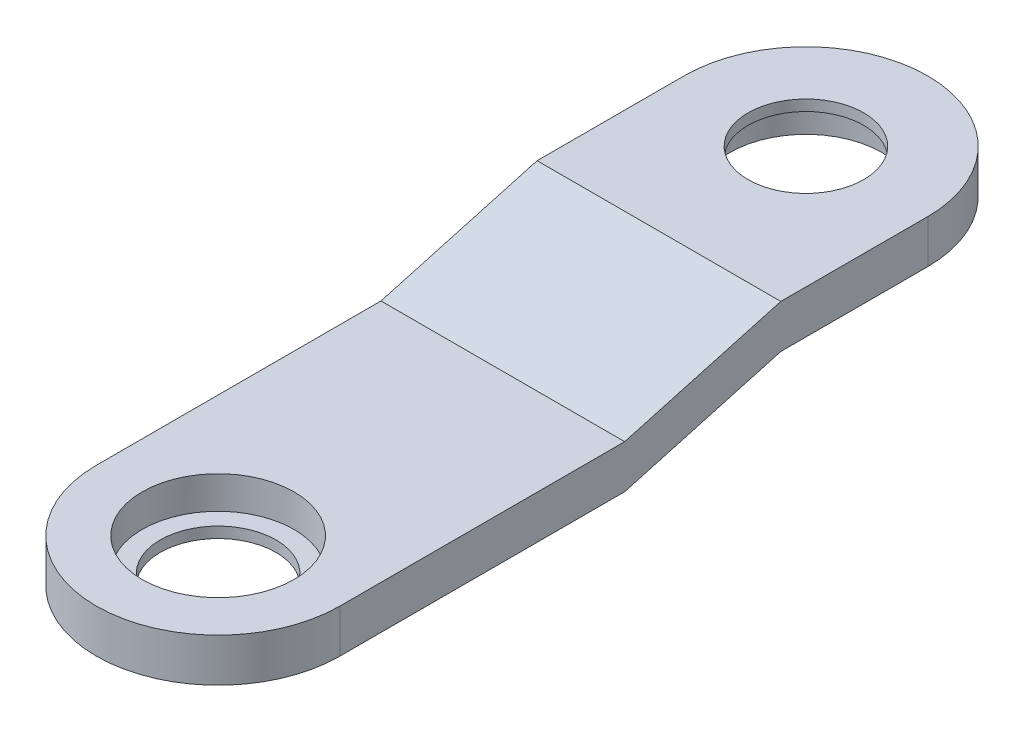
ISO-10303-21;
HEADER;
FILE_DESCRIPTION(('STEP AP214'),'2;1');
FILE_NAME('part.step','',(''),(''),'','','');
FILE_SCHEMA(('AUTOMOTIVE_DESIGN { 1 0 10303 214 1 1 1 1 }'));
ENDSEC;
DATA;
#1=APPLICATION_CONTEXT('core data for automotive mechanical design processes');
#2=APPLICATION_PROTOCOL_DEFINITION('international standard','automotive_design',2000,#1);
#3=PRODUCT_CONTEXT('',#1,'mechanical');
#4=PRODUCT('Part','Part','',(#3));
#5=PRODUCT_RELATED_PRODUCT_CATEGORY('part','',(#4));
#6=PRODUCT_DEFINITION_FORMATION('','',#4);
#7=PRODUCT_DEFINITION_CONTEXT('part definition',#1,'design');
#8=PRODUCT_DEFINITION('design','',#6,#7);
#9=PRODUCT_DEFINITION_SHAPE('','',#8);
#10=(LENGTH_UNIT() NAMED_UNIT(*) SI_UNIT(.MILLI.,.METRE.));
#11=(NAMED_UNIT(*) PLANE_ANGLE_UNIT() SI_UNIT($,.RADIAN.));
#12=(NAMED_UNIT(*) SI_UNIT($,.STERADIAN.) SOLID_ANGLE_UNIT());
#13=UNCERTAINTY_MEASURE_WITH_UNIT(LENGTH_MEASURE(1.E-05),#10,'distance_accuracy_value','');
#14=(GEOMETRIC_REPRESENTATION_CONTEXT(3) GLOBAL_UNCERTAINTY_ASSIGNED_CONTEXT((#13)) GLOBAL_UNIT_ASSIGNED_CONTEXT((#10,
#11,#12)) REPRESENTATION_CONTEXT('',''));
#15=CARTESIAN_POINT('',(0.,0.,0.));
#16=DIRECTION('',(0.,0.,1.));
#17=DIRECTION('',(1.,0.,0.));
#18=AXIS2_PLACEMENT_3D('',#15,#16,#17);
#19=CARTESIAN_POINT('',(0.,0.,0.));
#20=DIRECTION('',(0.,1.,0.));
#21=DIRECTION('',(0.,0.,1.));
#22=AXIS2_PLACEMENT_3D('',#19,#20,#21);
#23=PLANE('',#22);
#24=CARTESIAN_POINT('',(0.,0.,0.));
#25=DIRECTION('',(0.,-1.,0.));
#26=DIRECTION('',(0.,0.,-1.));
#27=AXIS2_PLACEMENT_3D('',#24,#25,#26);
#28=CIRCLE('',#27,8.);
#29=CARTESIAN_POINT('',(0.,0.,-8.));
#30=VERTEX_POINT('',#29);
#31=EDGE_CURVE('E189',#30,#30,#28,.T.);
#32=ORIENTED_EDGE('',*,*,#31,.F.);
#33=EDGE_LOOP('',(#32));
#34=FACE_BOUND('',#33,.T.);
#35=DIRECTION('',(-1.,0.,0.));
#36=VECTOR('',#35,1.);
#37=CARTESIAN_POINT('',(16.849999955,0.,-39.37));
#38=LINE('',#37,#36);
#39=CARTESIAN_POINT('',(16.849999955,0.,-39.37));
#40=VERTEX_POINT('',#39);
#41=CARTESIAN_POINT('',(-16.849999955,0.,-39.37));
#42=VERTEX_POINT('',#41);
#43=EDGE_CURVE('E124',#40,#42,#38,.T.);
#44=ORIENTED_EDGE('',*,*,#43,.F.);
#45=DIRECTION('',(0.,0.,-1.));
#46=VECTOR('',#45,1.);
#47=CARTESIAN_POINT('',(16.849999955,0.,0.));
#48=LINE('',#47,#46);
#49=CARTESIAN_POINT('',(16.849999955,0.,0.));
#50=VERTEX_POINT('',#49);
#51=EDGE_CURVE('E122',#50,#40,#48,.T.);
#52=ORIENTED_EDGE('',*,*,#51,.F.);
#53=CARTESIAN_POINT('',(0.,0.,0.));
#54=DIRECTION('',(0.,1.,0.));
#55=DIRECTION('',(0.,0.,1.));
#56=AXIS2_PLACEMENT_3D('',#53,#54,#55);
#57=CIRCLE('',#56,16.849999955);
#58=CARTESIAN_POINT('',(-16.849999955,0.,0.));
#59=VERTEX_POINT('',#58);
#60=EDGE_CURVE('E136',#59,#50,#57,.T.);
#61=ORIENTED_EDGE('',*,*,#60,.F.);
#62=DIRECTION('',(0.,0.,1.));
#63=VECTOR('',#62,1.);
#64=CARTESIAN_POINT('',(-16.849999955,0.,0.));
#65=LINE('',#64,#63);
#66=EDGE_CURVE('E145',#42,#59,#65,.T.);
#67=ORIENTED_EDGE('',*,*,#66,.F.);
#68=EDGE_LOOP('',(#44,#52,#61,#67));
#69=FACE_BOUND('',#68,.T.);
#70=ADVANCED_FACE('F39',(#34,#69),#23,.F.);
#71=CARTESIAN_POINT('',(16.849999955,12.,0.));
#72=DIRECTION('',(-1.,0.,0.));
#73=DIRECTION('',(0.,0.,1.));
#74=AXIS2_PLACEMENT_3D('',#71,#72,#73);
#75=PLANE('',#74);
#76=DIRECTION('',(0.,-0.267758944517911,0.963485935356949));
#77=VECTOR('',#76,1.);
#78=CARTESIAN_POINT('',(16.849999955,6.,-60.96));
#79=LINE('',#78,#77);
#80=CARTESIAN_POINT('',(16.849999955,6.,-60.96));
#81=VERTEX_POINT('',#80);
#82=EDGE_CURVE('E105',#81,#40,#79,.T.);
#83=ORIENTED_EDGE('',*,*,#82,.F.);
#84=DIRECTION('',(0.,0.,1.));
#85=VECTOR('',#84,1.);
#86=CARTESIAN_POINT('',(16.849999955,6.,0.));
#87=LINE('',#86,#85);
#88=CARTESIAN_POINT('',(16.849999955,6.,-81.28));
#89=VERTEX_POINT('',#88);
#90=EDGE_CURVE('E119',#89,#81,#87,.T.);
#91=ORIENTED_EDGE('',*,*,#90,.F.);
#92=DIRECTION('',(0.,-1.,0.));
#93=VECTOR('',#92,1.);
#94=CARTESIAN_POINT('',(16.849999955,12.,-81.28));
#95=LINE('',#94,#93);
#96=CARTESIAN_POINT('',(16.849999955,12.,-81.28));
#97=VERTEX_POINT('',#96);
#98=EDGE_CURVE('E49',#97,#89,#95,.T.);
#99=ORIENTED_EDGE('',*,*,#98,.F.);
#100=DIRECTION('',(0.,0.,-1.));
#101=VECTOR('',#100,1.);
#102=CARTESIAN_POINT('',(16.849999955,12.,0.));
#103=LINE('',#102,#101);
#104=CARTESIAN_POINT('',(16.849999955,12.,-60.96));
#105=VERTEX_POINT('',#104);
#106=EDGE_CURVE('E141',#105,#97,#103,.T.);
#107=ORIENTED_EDGE('',*,*,#106,.F.);
#108=DIRECTION('',(0.,0.267758944517911,-0.963485935356949));
#109=VECTOR('',#108,1.);
#110=CARTESIAN_POINT('',(16.849999955,6.,-39.37));
#111=LINE('',#110,#109);
#112=CARTESIAN_POINT('',(16.849999955,6.,-39.37));
#113=VERTEX_POINT('',#112);
#114=EDGE_CURVE('E175',#113,#105,#111,.T.);
#115=ORIENTED_EDGE('',*,*,#114,.F.);
#116=DIRECTION('',(0.,0.,-1.));
#117=VECTOR('',#116,1.);
#118=CARTESIAN_POINT('',(16.849999955,6.,-20.32));
#119=LINE('',#118,#117);
#120=CARTESIAN_POINT('',(16.849999955,6.,0.));
#121=VERTEX_POINT('',#120);
#122=EDGE_CURVE('E209',#121,#113,#119,.T.);
#123=ORIENTED_EDGE('',*,*,#122,.F.);
#124=DIRECTION('',(0.,-1.,0.));
#125=VECTOR('',#124,1.);
#126=CARTESIAN_POINT('',(16.849999955,12.,0.));
#127=LINE('',#126,#125);
#128=EDGE_CURVE('E11',#121,#50,#127,.T.);
#129=ORIENTED_EDGE('',*,*,#128,.T.);
#130=ORIENTED_EDGE('',*,*,#51,.T.);
#131=EDGE_LOOP('',(#83,#91,#99,#107,#115,#123,#129,#130));
#132=FACE_BOUND('',#131,.T.);
#133=ADVANCED_FACE('F117',(#132),#75,.F.);
#134=CARTESIAN_POINT('',(-16.849999955,12.,0.));
#135=DIRECTION('',(1.,0.,0.));
#136=DIRECTION('',(0.,0.,-1.));
#137=AXIS2_PLACEMENT_3D('',#134,#135,#136);
#138=PLANE('',#137);
#139=DIRECTION('',(0.,-0.267758944517911,0.963485935356949));
#140=VECTOR('',#139,1.);
#141=CARTESIAN_POINT('',(-16.849999955,6.,-60.96));
#142=LINE('',#141,#140);
#143=CARTESIAN_POINT('',(-16.849999955,6.,-60.96));
#144=VERTEX_POINT('',#143);
#145=EDGE_CURVE('E64',#144,#42,#142,.T.);
#146=ORIENTED_EDGE('',*,*,#145,.T.);
#147=ORIENTED_EDGE('',*,*,#66,.T.);
#148=DIRECTION('',(0.,-1.,0.));
#149=VECTOR('',#148,1.);
#150=CARTESIAN_POINT('',(-16.849999955,12.,0.));
#151=LINE('',#150,#149);
#152=CARTESIAN_POINT('',(-16.849999955,6.,0.));
#153=VERTEX_POINT('',#152);
#154=EDGE_CURVE('E152',#153,#59,#151,.T.);
#155=ORIENTED_EDGE('',*,*,#154,.F.);
#156=DIRECTION('',(0.,0.,1.));
#157=VECTOR('',#156,1.);
#158=CARTESIAN_POINT('',(-16.849999955,6.,0.));
#159=LINE('',#158,#157);
#160=CARTESIAN_POINT('',(-16.849999955,6.,-39.37));
#161=VERTEX_POINT('',#160);
#162=EDGE_CURVE('E56',#161,#153,#159,.T.);
#163=ORIENTED_EDGE('',*,*,#162,.F.);
#164=DIRECTION('',(0.,0.267758944517911,-0.963485935356949));
#165=VECTOR('',#164,1.);
#166=CARTESIAN_POINT('',(-16.849999955,6.,-39.37));
#167=LINE('',#166,#165);
#168=CARTESIAN_POINT('',(-16.849999955,12.,-60.96));
#169=VERTEX_POINT('',#168);
#170=EDGE_CURVE('E191',#161,#169,#167,.T.);
#171=ORIENTED_EDGE('',*,*,#170,.T.);
#172=DIRECTION('',(0.,0.,1.));
#173=VECTOR('',#172,1.);
#174=CARTESIAN_POINT('',(-16.849999955,12.,0.));
#175=LINE('',#174,#173);
#176=CARTESIAN_POINT('',(-16.849999955,12.,-81.28));
#177=VERTEX_POINT('',#176);
#178=EDGE_CURVE('E148',#177,#169,#175,.T.);
#179=ORIENTED_EDGE('',*,*,#178,.F.);
#180=DIRECTION('',(0.,-1.,0.));
#181=VECTOR('',#180,1.);
#182=CARTESIAN_POINT('',(-16.849999955,12.,-81.28));
#183=LINE('',#182,#181);
#184=CARTESIAN_POINT('',(-16.849999955,6.,-81.28));
#185=VERTEX_POINT('',#184);
#186=EDGE_CURVE('E163',#177,#185,#183,.T.);
#187=ORIENTED_EDGE('',*,*,#186,.T.);
#188=DIRECTION('',(0.,0.,-1.));
#189=VECTOR('',#188,1.);
#190=CARTESIAN_POINT('',(-16.849999955,6.,0.));
#191=LINE('',#190,#189);
#192=EDGE_CURVE('E111',#144,#185,#191,.T.);
#193=ORIENTED_EDGE('',*,*,#192,.F.);
#194=EDGE_LOOP('',(#146,#147,#155,#163,#171,#179,#187,#193));
#195=FACE_BOUND('',#194,.T.);
#196=ADVANCED_FACE('F226',(#195),#138,.F.);
#197=CARTESIAN_POINT('',(0.,12.,0.));
#198=DIRECTION('',(0.,1.,0.));
#199=DIRECTION('',(0.,0.,1.));
#200=AXIS2_PLACEMENT_3D('',#197,#198,#199);
#201=PLANE('',#200);
#202=CARTESIAN_POINT('',(0.,12.,-81.28));
#203=DIRECTION('',(0.,1.,0.));
#204=DIRECTION('',(0.,0.,1.));
#205=AXIS2_PLACEMENT_3D('',#202,#203,#204);
#206=CIRCLE('',#205,8.);
#207=CARTESIAN_POINT('',(0.,12.,-73.28));
#208=VERTEX_POINT('',#207);
#209=EDGE_CURVE('E218',#208,#208,#206,.T.);
#210=ORIENTED_EDGE('',*,*,#209,.F.);
#211=EDGE_LOOP('',(#210));
#212=FACE_BOUND('',#211,.T.);
#213=ORIENTED_EDGE('',*,*,#178,.T.);
#214=DIRECTION('',(-1.,0.,0.));
#215=VECTOR('',#214,1.);
#216=CARTESIAN_POINT('',(16.849999955,12.,-60.96));
#217=LINE('',#216,#215);
#218=EDGE_CURVE('E179',#105,#169,#217,.T.);
#219=ORIENTED_EDGE('',*,*,#218,.F.);
#220=ORIENTED_EDGE('',*,*,#106,.T.);
#221=CARTESIAN_POINT('',(0.,12.,-81.28));
#222=DIRECTION('',(0.,1.,0.));
#223=DIRECTION('',(0.,0.,1.));
#224=AXIS2_PLACEMENT_3D('',#221,#222,#223);
#225=CIRCLE('',#224,16.849999955);
#226=EDGE_CURVE('E144',#97,#177,#225,.T.);
#227=ORIENTED_EDGE('',*,*,#226,.T.);
#228=EDGE_LOOP('',(#213,#219,#220,#227));
#229=FACE_BOUND('',#228,.T.);
#230=ADVANCED_FACE('F178',(#212,#229),#201,.T.);
#231=CARTESIAN_POINT('',(0.,12.,0.));
#232=DIRECTION('',(0.,-1.,0.));
#233=DIRECTION('',(0.,0.,-1.));
#234=AXIS2_PLACEMENT_3D('',#231,#232,#233);
#235=CYLINDRICAL_SURFACE('',#234,10.499999955);
#236=CARTESIAN_POINT('',(0.,6.,0.));
#237=DIRECTION('',(0.,1.,0.));
#238=DIRECTION('',(0.,0.,1.));
#239=AXIS2_PLACEMENT_3D('',#236,#237,#238);
#240=CIRCLE('',#239,10.499999955);
#241=CARTESIAN_POINT('',(0.,6.,10.499999955));
#242=VERTEX_POINT('',#241);
#243=EDGE_CURVE('E43',#242,#242,#240,.T.);
#244=ORIENTED_EDGE('',*,*,#243,.T.);
#245=EDGE_LOOP('',(#244));
#246=FACE_BOUND('',#245,.T.);
#247=CARTESIAN_POINT('',(0.,1.5,0.));
#248=DIRECTION('',(0.,-1.,0.));
#249=DIRECTION('',(0.,0.,-1.));
#250=AXIS2_PLACEMENT_3D('',#247,#248,#249);
#251=CIRCLE('',#250,10.499999955);
#252=CARTESIAN_POINT('',(0.,1.5,-10.499999955));
#253=VERTEX_POINT('',#252);
#254=EDGE_CURVE('E199',#253,#253,#251,.T.);
#255=ORIENTED_EDGE('',*,*,#254,.T.);
#256=EDGE_LOOP('',(#255));
#257=FACE_BOUND('',#256,.T.);
#258=ADVANCED_FACE('F277',(#246,#257),#235,.F.);
#259=CARTESIAN_POINT('',(0.,12.,0.));
#260=DIRECTION('',(0.,-1.,0.));
#261=DIRECTION('',(0.,0.,-1.));
#262=AXIS2_PLACEMENT_3D('',#259,#260,#261);
#263=CYLINDRICAL_SURFACE('',#262,16.849999955);
#264=CARTESIAN_POINT('',(0.,6.,0.));
#265=DIRECTION('',(0.,1.,0.));
#266=DIRECTION('',(0.,0.,1.));
#267=AXIS2_PLACEMENT_3D('',#264,#265,#266);
#268=CIRCLE('',#267,16.849999955);
#269=EDGE_CURVE('E206',#153,#121,#268,.T.);
#270=ORIENTED_EDGE('',*,*,#269,.F.);
#271=ORIENTED_EDGE('',*,*,#154,.T.);
#272=ORIENTED_EDGE('',*,*,#60,.T.);
#273=ORIENTED_EDGE('',*,*,#128,.F.);
#274=EDGE_LOOP('',(#270,#271,#272,#273));
#275=FACE_BOUND('',#274,.T.);
#276=ADVANCED_FACE('F41',(#275),#263,.T.);
#277=CARTESIAN_POINT('',(0.,12.,-81.28));
#278=DIRECTION('',(0.,-1.,0.));
#279=DIRECTION('',(0.,0.,-1.));
#280=AXIS2_PLACEMENT_3D('',#277,#278,#279);
#281=CYLINDRICAL_SURFACE('',#280,10.499999955);
#282=CARTESIAN_POINT('',(0.,6.,-81.28));
#283=DIRECTION('',(0.,-1.,0.));
#284=DIRECTION('',(0.,0.,-1.));
#285=AXIS2_PLACEMENT_3D('',#282,#283,#284);
#286=CIRCLE('',#285,10.499999955);
#287=CARTESIAN_POINT('',(0.,6.,-91.779999955));
#288=VERTEX_POINT('',#287);
#289=EDGE_CURVE('E131',#288,#288,#286,.F.);
#290=ORIENTED_EDGE('',*,*,#289,.F.);
#291=EDGE_LOOP('',(#290));
#292=FACE_BOUND('',#291,.T.);
#293=CARTESIAN_POINT('',(0.,10.5,-81.28));
#294=DIRECTION('',(0.,1.,0.));
#295=DIRECTION('',(0.,0.,1.));
#296=AXIS2_PLACEMENT_3D('',#293,#294,#295);
#297=CIRCLE('',#296,10.499999955);
#298=CARTESIAN_POINT('',(0.,10.5,-70.780000045));
#299=VERTEX_POINT('',#298);
#300=EDGE_CURVE('E112',#299,#299,#297,.T.);
#301=ORIENTED_EDGE('',*,*,#300,.T.);
#302=EDGE_LOOP('',(#301));
#303=FACE_BOUND('',#302,.T.);
#304=ADVANCED_FACE('F265',(#292,#303),#281,.F.);
#305=CARTESIAN_POINT('',(0.,12.,-81.28));
#306=DIRECTION('',(0.,-1.,0.));
#307=DIRECTION('',(0.,0.,-1.));
#308=AXIS2_PLACEMENT_3D('',#305,#306,#307);
#309=CYLINDRICAL_SURFACE('',#308,16.849999955);
#310=CARTESIAN_POINT('',(0.,6.,-81.28));
#311=DIRECTION('',(0.,-1.,0.));
#312=DIRECTION('',(0.,0.,-1.));
#313=AXIS2_PLACEMENT_3D('',#310,#311,#312);
#314=CIRCLE('',#313,16.849999955);
#315=EDGE_CURVE('E129',#185,#89,#314,.T.);
#316=ORIENTED_EDGE('',*,*,#315,.F.);
#317=ORIENTED_EDGE('',*,*,#186,.F.);
#318=ORIENTED_EDGE('',*,*,#226,.F.);
#319=ORIENTED_EDGE('',*,*,#98,.T.);
#320=EDGE_LOOP('',(#316,#317,#318,#319));
#321=FACE_BOUND('',#320,.T.);
#322=ADVANCED_FACE('F170',(#321),#309,.T.);
#323=CARTESIAN_POINT('',(0.,6.,0.));
#324=DIRECTION('',(0.,-1.,0.));
#325=DIRECTION('',(0.,0.,-1.));
#326=AXIS2_PLACEMENT_3D('',#323,#324,#325);
#327=PLANE('',#326);
#328=DIRECTION('',(1.,0.,0.));
#329=VECTOR('',#328,1.);
#330=CARTESIAN_POINT('',(0.,6.,-60.96));
#331=LINE('',#330,#329);
#332=EDGE_CURVE('E102',#144,#81,#331,.T.);
#333=ORIENTED_EDGE('',*,*,#332,.F.);
#334=ORIENTED_EDGE('',*,*,#192,.T.);
#335=ORIENTED_EDGE('',*,*,#315,.T.);
#336=ORIENTED_EDGE('',*,*,#90,.T.);
#337=EDGE_LOOP('',(#333,#334,#335,#336));
#338=FACE_BOUND('',#337,.T.);
#339=ORIENTED_EDGE('',*,*,#289,.T.);
#340=EDGE_LOOP('',(#339));
#341=FACE_BOUND('',#340,.T.);
#342=ADVANCED_FACE('F126',(#338,#341),#327,.T.);
#343=CARTESIAN_POINT('',(0.,10.5,-81.28));
#344=DIRECTION('',(0.,1.,0.));
#345=DIRECTION('',(0.,0.,1.));
#346=AXIS2_PLACEMENT_3D('',#343,#344,#345);
#347=PLANE('',#346);
#348=CARTESIAN_POINT('',(0.,10.5,-81.28));
#349=DIRECTION('',(0.,1.,0.));
#350=DIRECTION('',(0.,0.,1.));
#351=AXIS2_PLACEMENT_3D('',#348,#349,#350);
#352=CIRCLE('',#351,8.);
#353=CARTESIAN_POINT('',(0.,10.5,-73.28));
#354=VERTEX_POINT('',#353);
#355=EDGE_CURVE('E214',#354,#354,#352,.T.);
#356=ORIENTED_EDGE('',*,*,#355,.T.);
#357=EDGE_LOOP('',(#356));
#358=FACE_BOUND('',#357,.T.);
#359=ORIENTED_EDGE('',*,*,#300,.F.);
#360=EDGE_LOOP('',(#359));
#361=FACE_BOUND('',#360,.T.);
#362=ADVANCED_FACE('F270',(#358,#361),#347,.F.);
#363=CARTESIAN_POINT('',(0.,10.5,-81.28));
#364=DIRECTION('',(0.,1.,0.));
#365=DIRECTION('',(0.,0.,1.));
#366=AXIS2_PLACEMENT_3D('',#363,#364,#365);
#367=CYLINDRICAL_SURFACE('',#366,8.);
#368=ORIENTED_EDGE('',*,*,#355,.F.);
#369=EDGE_LOOP('',(#368));
#370=FACE_BOUND('',#369,.T.);
#371=ORIENTED_EDGE('',*,*,#209,.T.);
#372=EDGE_LOOP('',(#371));
#373=FACE_BOUND('',#372,.T.);
#374=ADVANCED_FACE('F298',(#370,#373),#367,.F.);
#375=CARTESIAN_POINT('',(0.,6.,0.));
#376=DIRECTION('',(0.,1.,0.));
#377=DIRECTION('',(0.,0.,1.));
#378=AXIS2_PLACEMENT_3D('',#375,#376,#377);
#379=PLANE('',#378);
#380=ORIENTED_EDGE('',*,*,#243,.F.);
#381=EDGE_LOOP('',(#380));
#382=FACE_BOUND('',#381,.T.);
#383=ORIENTED_EDGE('',*,*,#269,.T.);
#384=ORIENTED_EDGE('',*,*,#122,.T.);
#385=DIRECTION('',(-1.,0.,0.));
#386=VECTOR('',#385,1.);
#387=CARTESIAN_POINT('',(16.849999955,6.,-39.37));
#388=LINE('',#387,#386);
#389=EDGE_CURVE('E185',#113,#161,#388,.T.);
#390=ORIENTED_EDGE('',*,*,#389,.T.);
#391=ORIENTED_EDGE('',*,*,#162,.T.);
#392=EDGE_LOOP('',(#383,#384,#390,#391));
#393=FACE_BOUND('',#392,.T.);
#394=ADVANCED_FACE('F239',(#382,#393),#379,.T.);
#395=CARTESIAN_POINT('',(0.,1.5,0.));
#396=DIRECTION('',(0.,-1.,0.));
#397=DIRECTION('',(0.,0.,-1.));
#398=AXIS2_PLACEMENT_3D('',#395,#396,#397);
#399=PLANE('',#398);
#400=CARTESIAN_POINT('',(0.,1.5,0.));
#401=DIRECTION('',(0.,-1.,0.));
#402=DIRECTION('',(0.,0.,-1.));
#403=AXIS2_PLACEMENT_3D('',#400,#401,#402);
#404=CIRCLE('',#403,8.);
#405=CARTESIAN_POINT('',(0.,1.5,-8.));
#406=VERTEX_POINT('',#405);
#407=EDGE_CURVE('E195',#406,#406,#404,.T.);
#408=ORIENTED_EDGE('',*,*,#407,.T.);
#409=EDGE_LOOP('',(#408));
#410=FACE_BOUND('',#409,.T.);
#411=ORIENTED_EDGE('',*,*,#254,.F.);
#412=EDGE_LOOP('',(#411));
#413=FACE_BOUND('',#412,.T.);
#414=ADVANCED_FACE('F249',(#410,#413),#399,.F.);
#415=CARTESIAN_POINT('',(0.,1.5,0.));
#416=DIRECTION('',(0.,-1.,0.));
#417=DIRECTION('',(0.,0.,-1.));
#418=AXIS2_PLACEMENT_3D('',#415,#416,#417);
#419=CYLINDRICAL_SURFACE('',#418,8.);
#420=ORIENTED_EDGE('',*,*,#407,.F.);
#421=EDGE_LOOP('',(#420));
#422=FACE_BOUND('',#421,.T.);
#423=ORIENTED_EDGE('',*,*,#31,.T.);
#424=EDGE_LOOP('',(#423));
#425=FACE_BOUND('',#424,.T.);
#426=ADVANCED_FACE('F242',(#422,#425),#419,.F.);
#427=CARTESIAN_POINT('',(16.849999955,6.,-39.37));
#428=DIRECTION('',(0.,0.963485935356949,0.267758944517911));
#429=DIRECTION('',(0.,-0.267758944517911,0.963485935356949));
#430=AXIS2_PLACEMENT_3D('',#427,#428,#429);
#431=PLANE('',#430);
#432=ORIENTED_EDGE('',*,*,#170,.F.);
#433=ORIENTED_EDGE('',*,*,#389,.F.);
#434=ORIENTED_EDGE('',*,*,#114,.T.);
#435=ORIENTED_EDGE('',*,*,#218,.T.);
#436=EDGE_LOOP('',(#432,#433,#434,#435));
#437=FACE_BOUND('',#436,.T.);
#438=ADVANCED_FACE('F240',(#437),#431,.T.);
#439=CARTESIAN_POINT('',(16.849999955,6.,-60.96));
#440=DIRECTION('',(0.,-0.963485935356949,-0.267758944517911));
#441=DIRECTION('',(0.,0.267758944517911,-0.963485935356949));
#442=AXIS2_PLACEMENT_3D('',#439,#440,#441);
#443=PLANE('',#442);
#444=ORIENTED_EDGE('',*,*,#145,.F.);
#445=ORIENTED_EDGE('',*,*,#332,.T.);
#446=ORIENTED_EDGE('',*,*,#82,.T.);
#447=ORIENTED_EDGE('',*,*,#43,.T.);
#448=EDGE_LOOP('',(#444,#445,#446,#447));
#449=FACE_BOUND('',#448,.T.);
#450=ADVANCED_FACE('F104',(#449),#443,.T.);
#451=CLOSED_SHELL('',(#70,#133,#196,#230,#258,#276,#304,#322,#342,#362,#374,#394,#414,#426,#438,#450));
#452=MANIFOLD_SOLID_BREP('B2',#451);
#453=ADVANCED_BREP_SHAPE_REPRESENTATION('',(#18,#452),#14);
#454=SHAPE_DEFINITION_REPRESENTATION(#9,#453);
ENDSEC;
END-ISO-10303-21;
